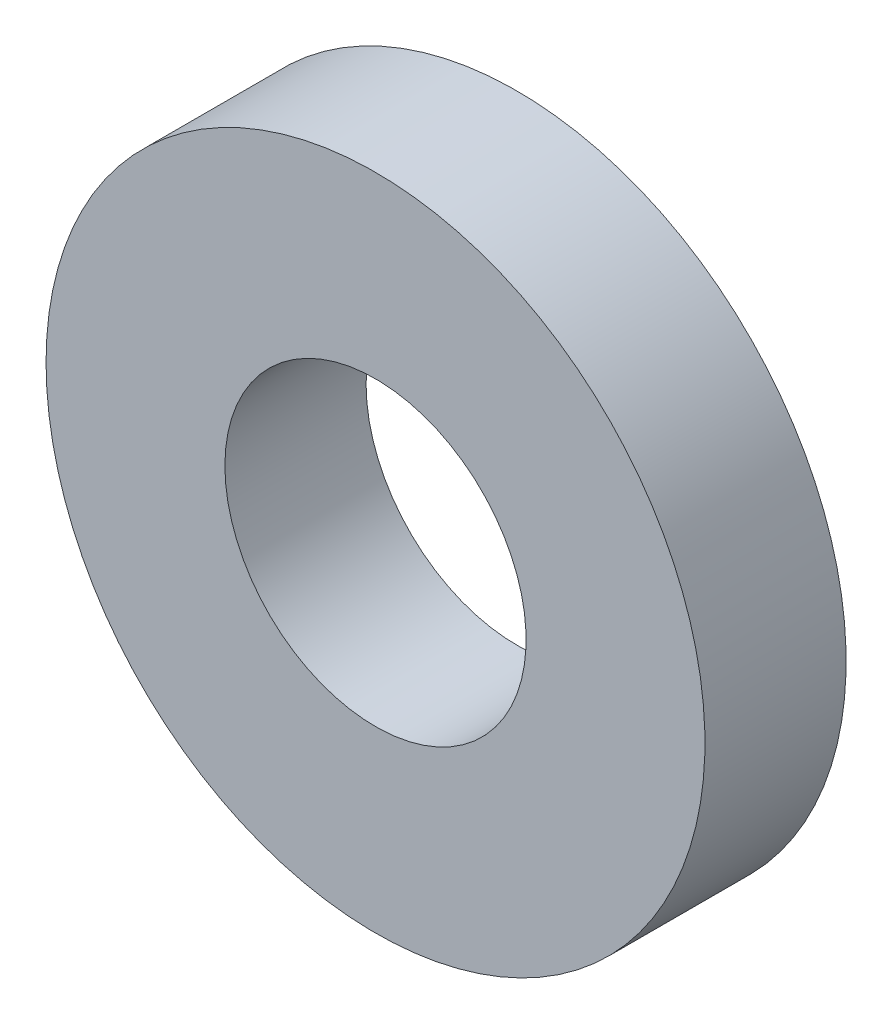
ISO-10303-21;
HEADER;
FILE_DESCRIPTION(('STEP AP214'),'2;1');
FILE_NAME('part.step','',(''),(''),'','','');
FILE_SCHEMA(('AUTOMOTIVE_DESIGN { 1 0 10303 214 1 1 1 1 }'));
ENDSEC;
DATA;
#1=APPLICATION_CONTEXT('core data for automotive mechanical design processes');
#2=APPLICATION_PROTOCOL_DEFINITION('international standard','automotive_design',2000,#1);
#3=PRODUCT_CONTEXT('',#1,'mechanical');
#4=PRODUCT('Part','Part','',(#3));
#5=PRODUCT_RELATED_PRODUCT_CATEGORY('part','',(#4));
#6=PRODUCT_DEFINITION_FORMATION('','',#4);
#7=PRODUCT_DEFINITION_CONTEXT('part definition',#1,'design');
#8=PRODUCT_DEFINITION('design','',#6,#7);
#9=PRODUCT_DEFINITION_SHAPE('','',#8);
#10=(LENGTH_UNIT() NAMED_UNIT(*) SI_UNIT(.MILLI.,.METRE.));
#11=(NAMED_UNIT(*) PLANE_ANGLE_UNIT() SI_UNIT($,.RADIAN.));
#12=(NAMED_UNIT(*) SI_UNIT($,.STERADIAN.) SOLID_ANGLE_UNIT());
#13=UNCERTAINTY_MEASURE_WITH_UNIT(LENGTH_MEASURE(1.E-05),#10,'distance_accuracy_value','');
#14=(GEOMETRIC_REPRESENTATION_CONTEXT(3) GLOBAL_UNCERTAINTY_ASSIGNED_CONTEXT((#13)) GLOBAL_UNIT_ASSIGNED_CONTEXT((#10,
#11,#12)) REPRESENTATION_CONTEXT('',''));
#15=CARTESIAN_POINT('',(0.,0.,0.));
#16=DIRECTION('',(0.,0.,1.));
#17=DIRECTION('',(1.,0.,0.));
#18=AXIS2_PLACEMENT_3D('',#15,#16,#17);
#19=CARTESIAN_POINT('',(0.,0.,0.));
#20=DIRECTION('',(0.,0.,1.));
#21=DIRECTION('',(1.,0.,0.));
#22=AXIS2_PLACEMENT_3D('',#19,#20,#21);
#23=PLANE('',#22);
#24=CARTESIAN_POINT('',(0.,0.,0.));
#25=DIRECTION('',(0.,0.,-1.));
#26=DIRECTION('',(1.,0.,0.));
#27=AXIS2_PLACEMENT_3D('',#24,#25,#26);
#28=CIRCLE('',#27,1.6);
#29=CARTESIAN_POINT('',(-1.6,0.,0.));
#30=VERTEX_POINT('',#29);
#31=EDGE_CURVE('E57',#30,#30,#28,.T.);
#32=ORIENTED_EDGE('',*,*,#31,.F.);
#33=EDGE_LOOP('',(#32));
#34=FACE_BOUND('',#33,.T.);
#35=CARTESIAN_POINT('',(0.,0.,0.));
#36=DIRECTION('',(0.,0.,1.));
#37=DIRECTION('',(1.,0.,0.));
#38=AXIS2_PLACEMENT_3D('',#35,#36,#37);
#39=CIRCLE('',#38,3.5);
#40=CARTESIAN_POINT('',(-3.5,0.,0.));
#41=VERTEX_POINT('',#40);
#42=EDGE_CURVE('E11',#41,#41,#39,.T.);
#43=ORIENTED_EDGE('',*,*,#42,.F.);
#44=EDGE_LOOP('',(#43));
#45=FACE_BOUND('',#44,.T.);
#46=ADVANCED_FACE('F17',(#34,#45),#23,.F.);
#47=CARTESIAN_POINT('',(0.,0.,1.5));
#48=DIRECTION('',(0.,0.,1.));
#49=DIRECTION('',(1.,0.,0.));
#50=AXIS2_PLACEMENT_3D('',#47,#48,#49);
#51=PLANE('',#50);
#52=CARTESIAN_POINT('',(0.,0.,1.5));
#53=DIRECTION('',(0.,0.,-1.));
#54=DIRECTION('',(1.,0.,0.));
#55=AXIS2_PLACEMENT_3D('',#52,#53,#54);
#56=CIRCLE('',#55,1.6);
#57=CARTESIAN_POINT('',(-1.6,0.,1.5));
#58=VERTEX_POINT('',#57);
#59=EDGE_CURVE('E55',#58,#58,#56,.T.);
#60=ORIENTED_EDGE('',*,*,#59,.T.);
#61=EDGE_LOOP('',(#60));
#62=FACE_BOUND('',#61,.T.);
#63=CARTESIAN_POINT('',(0.,0.,1.5));
#64=DIRECTION('',(0.,0.,1.));
#65=DIRECTION('',(1.,0.,0.));
#66=AXIS2_PLACEMENT_3D('',#63,#64,#65);
#67=CIRCLE('',#66,3.5);
#68=CARTESIAN_POINT('',(-3.5,0.,1.5));
#69=VERTEX_POINT('',#68);
#70=EDGE_CURVE('E70',#69,#69,#67,.T.);
#71=ORIENTED_EDGE('',*,*,#70,.T.);
#72=EDGE_LOOP('',(#71));
#73=FACE_BOUND('',#72,.T.);
#74=ADVANCED_FACE('F61',(#62,#73),#51,.T.);
#75=CARTESIAN_POINT('',(0.,0.,0.));
#76=DIRECTION('',(0.,0.,1.));
#77=DIRECTION('',(1.,0.,0.));
#78=AXIS2_PLACEMENT_3D('',#75,#76,#77);
#79=CYLINDRICAL_SURFACE('',#78,3.5);
#80=ORIENTED_EDGE('',*,*,#70,.F.);
#81=DIRECTION('',(0.,0.,-1.));
#82=VECTOR('',#81,1.);
#83=CARTESIAN_POINT('',(-3.5,0.,0.));
#84=LINE('',#83,#82);
#85=EDGE_CURVE('E25',#69,#41,#84,.T.);
#86=ORIENTED_EDGE('',*,*,#85,.T.);
#87=ORIENTED_EDGE('',*,*,#42,.T.);
#88=ORIENTED_EDGE('',*,*,#85,.F.);
#89=EDGE_LOOP('',(#80,#86,#87,#88));
#90=FACE_BOUND('',#89,.T.);
#91=ADVANCED_FACE('F74',(#90),#79,.T.);
#92=CARTESIAN_POINT('',(0.,0.,0.));
#93=DIRECTION('',(0.,0.,1.));
#94=DIRECTION('',(1.,0.,0.));
#95=AXIS2_PLACEMENT_3D('',#92,#93,#94);
#96=CYLINDRICAL_SURFACE('',#95,1.6);
#97=ORIENTED_EDGE('',*,*,#59,.F.);
#98=DIRECTION('',(0.,0.,-1.));
#99=VECTOR('',#98,1.);
#100=CARTESIAN_POINT('',(-1.6,0.,0.));
#101=LINE('',#100,#99);
#102=EDGE_CURVE('E52',#58,#30,#101,.T.);
#103=ORIENTED_EDGE('',*,*,#102,.T.);
#104=ORIENTED_EDGE('',*,*,#31,.T.);
#105=ORIENTED_EDGE('',*,*,#102,.F.);
#106=EDGE_LOOP('',(#97,#103,#104,#105));
#107=FACE_BOUND('',#106,.T.);
#108=ADVANCED_FACE('F54',(#107),#96,.F.);
#109=CLOSED_SHELL('',(#46,#74,#91,#108));
#110=MANIFOLD_SOLID_BREP('B1',#109);
#111=ADVANCED_BREP_SHAPE_REPRESENTATION('',(#18,#110),#14);
#112=SHAPE_DEFINITION_REPRESENTATION(#9,#111);
ENDSEC;
END-ISO-10303-21;
